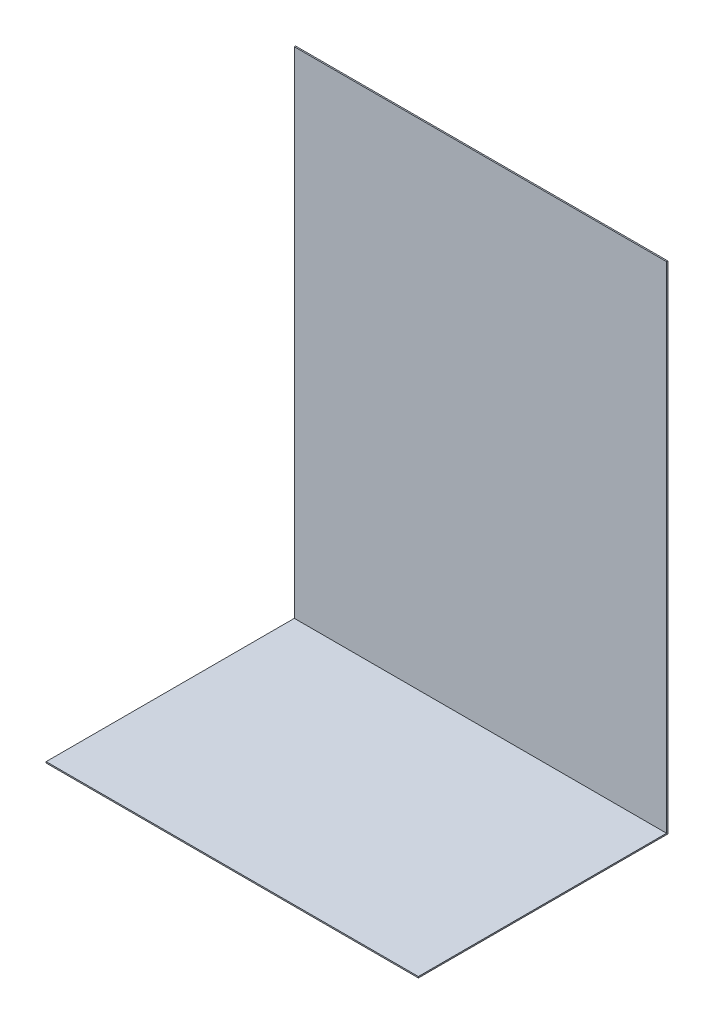
ISO-10303-21;
HEADER;
FILE_DESCRIPTION(('STEP AP214'),'2;1');
FILE_NAME('part.step','',(''),(''),'','','');
FILE_SCHEMA(('AUTOMOTIVE_DESIGN { 1 0 10303 214 1 1 1 1 }'));
ENDSEC;
DATA;
#1=APPLICATION_CONTEXT('core data for automotive mechanical design processes');
#2=APPLICATION_PROTOCOL_DEFINITION('international standard','automotive_design',2000,#1);
#3=PRODUCT_CONTEXT('',#1,'mechanical');
#4=PRODUCT('Part','Part','',(#3));
#5=PRODUCT_RELATED_PRODUCT_CATEGORY('part','',(#4));
#6=PRODUCT_DEFINITION_FORMATION('','',#4);
#7=PRODUCT_DEFINITION_CONTEXT('part definition',#1,'design');
#8=PRODUCT_DEFINITION('design','',#6,#7);
#9=PRODUCT_DEFINITION_SHAPE('','',#8);
#10=(LENGTH_UNIT() NAMED_UNIT(*) SI_UNIT(.MILLI.,.METRE.));
#11=(NAMED_UNIT(*) PLANE_ANGLE_UNIT() SI_UNIT($,.RADIAN.));
#12=(NAMED_UNIT(*) SI_UNIT($,.STERADIAN.) SOLID_ANGLE_UNIT());
#13=UNCERTAINTY_MEASURE_WITH_UNIT(LENGTH_MEASURE(1.E-05),#10,'distance_accuracy_value','');
#14=(GEOMETRIC_REPRESENTATION_CONTEXT(3) GLOBAL_UNCERTAINTY_ASSIGNED_CONTEXT((#13)) GLOBAL_UNIT_ASSIGNED_CONTEXT((#10,
#11,#12)) REPRESENTATION_CONTEXT('',''));
#15=CARTESIAN_POINT('',(0.,0.,0.));
#16=DIRECTION('',(0.,0.,1.));
#17=DIRECTION('',(1.,0.,0.));
#18=AXIS2_PLACEMENT_3D('',#15,#16,#17);
#19=CARTESIAN_POINT('',(914.4,1219.2,6.35));
#20=DIRECTION('',(-1.,0.,0.));
#21=DIRECTION('',(0.,-1.,0.));
#22=AXIS2_PLACEMENT_3D('',#19,#20,#21);
#23=PLANE('',#22);
#24=DIRECTION('',(0.,1.,0.));
#25=VECTOR('',#24,1.);
#26=CARTESIAN_POINT('',(914.4,1219.2,0.));
#27=LINE('',#26,#25);
#28=CARTESIAN_POINT('',(914.4,-1219.2,0.));
#29=VERTEX_POINT('',#28);
#30=CARTESIAN_POINT('',(914.4,1219.2,0.));
#31=VERTEX_POINT('',#30);
#32=EDGE_CURVE('E96',#29,#31,#27,.T.);
#33=ORIENTED_EDGE('',*,*,#32,.T.);
#34=DIRECTION('',(0.,0.,-1.));
#35=VECTOR('',#34,1.);
#36=CARTESIAN_POINT('',(914.4,1219.2,6.35));
#37=LINE('',#36,#35);
#38=CARTESIAN_POINT('',(914.4,1219.2,6.35));
#39=VERTEX_POINT('',#38);
#40=EDGE_CURVE('E11',#39,#31,#37,.T.);
#41=ORIENTED_EDGE('',*,*,#40,.F.);
#42=DIRECTION('',(0.,1.,0.));
#43=VECTOR('',#42,1.);
#44=CARTESIAN_POINT('',(914.4,1219.2,6.35));
#45=LINE('',#44,#43);
#46=CARTESIAN_POINT('',(914.4,-1212.85,6.35));
#47=VERTEX_POINT('',#46);
#48=EDGE_CURVE('E89',#47,#39,#45,.T.);
#49=ORIENTED_EDGE('',*,*,#48,.F.);
#50=DIRECTION('',(0.,0.,-1.));
#51=VECTOR('',#50,1.);
#52=CARTESIAN_POINT('',(914.4,-1212.85,1225.55));
#53=LINE('',#52,#51);
#54=CARTESIAN_POINT('',(914.4,-1212.85,1225.55));
#55=VERTEX_POINT('',#54);
#56=EDGE_CURVE('E104',#55,#47,#53,.T.);
#57=ORIENTED_EDGE('',*,*,#56,.F.);
#58=DIRECTION('',(0.,1.,0.));
#59=VECTOR('',#58,1.);
#60=CARTESIAN_POINT('',(914.4,-1219.2,1225.55));
#61=LINE('',#60,#59);
#62=CARTESIAN_POINT('',(914.4,-1219.2,1225.55));
#63=VERTEX_POINT('',#62);
#64=EDGE_CURVE('E99',#63,#55,#61,.T.);
#65=ORIENTED_EDGE('',*,*,#64,.F.);
#66=DIRECTION('',(0.,0.,-1.));
#67=VECTOR('',#66,1.);
#68=CARTESIAN_POINT('',(914.4,-1219.2,6.35));
#69=LINE('',#68,#67);
#70=EDGE_CURVE('E82',#63,#29,#69,.T.);
#71=ORIENTED_EDGE('',*,*,#70,.T.);
#72=EDGE_LOOP('',(#33,#41,#49,#57,#65,#71));
#73=FACE_BOUND('',#72,.T.);
#74=ADVANCED_FACE('F37',(#73),#23,.F.);
#75=CARTESIAN_POINT('',(-914.4,1219.2,6.35));
#76=DIRECTION('',(0.,-1.,0.));
#77=DIRECTION('',(0.,0.,-1.));
#78=AXIS2_PLACEMENT_3D('',#75,#76,#77);
#79=PLANE('',#78);
#80=DIRECTION('',(-1.,0.,0.));
#81=VECTOR('',#80,1.);
#82=CARTESIAN_POINT('',(-914.4,1219.2,0.));
#83=LINE('',#82,#81);
#84=CARTESIAN_POINT('',(-914.4,1219.2,0.));
#85=VERTEX_POINT('',#84);
#86=EDGE_CURVE('E103',#31,#85,#83,.T.);
#87=ORIENTED_EDGE('',*,*,#86,.T.);
#88=DIRECTION('',(0.,0.,-1.));
#89=VECTOR('',#88,1.);
#90=CARTESIAN_POINT('',(-914.4,1219.2,6.35));
#91=LINE('',#90,#89);
#92=CARTESIAN_POINT('',(-914.4,1219.2,6.35));
#93=VERTEX_POINT('',#92);
#94=EDGE_CURVE('E44',#93,#85,#91,.T.);
#95=ORIENTED_EDGE('',*,*,#94,.F.);
#96=DIRECTION('',(-1.,0.,0.));
#97=VECTOR('',#96,1.);
#98=CARTESIAN_POINT('',(-914.4,1219.2,6.35));
#99=LINE('',#98,#97);
#100=EDGE_CURVE('E57',#39,#93,#99,.T.);
#101=ORIENTED_EDGE('',*,*,#100,.F.);
#102=ORIENTED_EDGE('',*,*,#40,.T.);
#103=EDGE_LOOP('',(#87,#95,#101,#102));
#104=FACE_BOUND('',#103,.T.);
#105=ADVANCED_FACE('F120',(#104),#79,.F.);
#106=CARTESIAN_POINT('',(-914.4,1219.2,6.35));
#107=DIRECTION('',(1.,0.,0.));
#108=DIRECTION('',(0.,1.,0.));
#109=AXIS2_PLACEMENT_3D('',#106,#107,#108);
#110=PLANE('',#109);
#111=DIRECTION('',(0.,-1.,0.));
#112=VECTOR('',#111,1.);
#113=CARTESIAN_POINT('',(-914.4,1219.2,0.));
#114=LINE('',#113,#112);
#115=CARTESIAN_POINT('',(-914.4,-1219.2,0.));
#116=VERTEX_POINT('',#115);
#117=EDGE_CURVE('E90',#85,#116,#114,.T.);
#118=ORIENTED_EDGE('',*,*,#117,.T.);
#119=DIRECTION('',(0.,0.,-1.));
#120=VECTOR('',#119,1.);
#121=CARTESIAN_POINT('',(-914.4,-1219.2,6.35));
#122=LINE('',#121,#120);
#123=CARTESIAN_POINT('',(-914.4,-1219.2,1225.55));
#124=VERTEX_POINT('',#123);
#125=EDGE_CURVE('E85',#124,#116,#122,.T.);
#126=ORIENTED_EDGE('',*,*,#125,.F.);
#127=DIRECTION('',(0.,-1.,0.));
#128=VECTOR('',#127,1.);
#129=CARTESIAN_POINT('',(-914.4,-1219.2,1225.55));
#130=LINE('',#129,#128);
#131=CARTESIAN_POINT('',(-914.4,-1212.85,1225.55));
#132=VERTEX_POINT('',#131);
#133=EDGE_CURVE('E140',#132,#124,#130,.T.);
#134=ORIENTED_EDGE('',*,*,#133,.F.);
#135=DIRECTION('',(0.,0.,-1.));
#136=VECTOR('',#135,1.);
#137=CARTESIAN_POINT('',(-914.4,-1212.85,1225.55));
#138=LINE('',#137,#136);
#139=CARTESIAN_POINT('',(-914.4,-1212.85,6.35));
#140=VERTEX_POINT('',#139);
#141=EDGE_CURVE('E108',#132,#140,#138,.T.);
#142=ORIENTED_EDGE('',*,*,#141,.T.);
#143=DIRECTION('',(0.,-1.,0.));
#144=VECTOR('',#143,1.);
#145=CARTESIAN_POINT('',(-914.4,1219.2,6.35));
#146=LINE('',#145,#144);
#147=EDGE_CURVE('E100',#93,#140,#146,.T.);
#148=ORIENTED_EDGE('',*,*,#147,.F.);
#149=ORIENTED_EDGE('',*,*,#94,.T.);
#150=EDGE_LOOP('',(#118,#126,#134,#142,#148,#149));
#151=FACE_BOUND('',#150,.T.);
#152=ADVANCED_FACE('F117',(#151),#110,.F.);
#153=CARTESIAN_POINT('',(-914.4,-1219.2,6.35));
#154=DIRECTION('',(0.,1.,0.));
#155=DIRECTION('',(0.,0.,1.));
#156=AXIS2_PLACEMENT_3D('',#153,#154,#155);
#157=PLANE('',#156);
#158=DIRECTION('',(1.,0.,0.));
#159=VECTOR('',#158,1.);
#160=CARTESIAN_POINT('',(-914.4,-1219.2,0.));
#161=LINE('',#160,#159);
#162=EDGE_CURVE('E77',#116,#29,#161,.T.);
#163=ORIENTED_EDGE('',*,*,#162,.T.);
#164=ORIENTED_EDGE('',*,*,#70,.F.);
#165=DIRECTION('',(1.,0.,0.));
#166=VECTOR('',#165,1.);
#167=CARTESIAN_POINT('',(-914.4,-1219.2,1225.55));
#168=LINE('',#167,#166);
#169=EDGE_CURVE('E136',#124,#63,#168,.T.);
#170=ORIENTED_EDGE('',*,*,#169,.F.);
#171=ORIENTED_EDGE('',*,*,#125,.T.);
#172=EDGE_LOOP('',(#163,#164,#170,#171));
#173=FACE_BOUND('',#172,.T.);
#174=ADVANCED_FACE('F79',(#173),#157,.F.);
#175=CARTESIAN_POINT('',(0.,0.,6.35));
#176=DIRECTION('',(0.,0.,1.));
#177=DIRECTION('',(1.,0.,0.));
#178=AXIS2_PLACEMENT_3D('',#175,#176,#177);
#179=PLANE('',#178);
#180=DIRECTION('',(-1.,0.,0.));
#181=VECTOR('',#180,1.);
#182=CARTESIAN_POINT('',(-914.4,-1212.85,6.35));
#183=LINE('',#182,#181);
#184=EDGE_CURVE('E51',#47,#140,#183,.T.);
#185=ORIENTED_EDGE('',*,*,#184,.F.);
#186=ORIENTED_EDGE('',*,*,#48,.T.);
#187=ORIENTED_EDGE('',*,*,#100,.T.);
#188=ORIENTED_EDGE('',*,*,#147,.T.);
#189=EDGE_LOOP('',(#185,#186,#187,#188));
#190=FACE_BOUND('',#189,.T.);
#191=ADVANCED_FACE('F141',(#190),#179,.T.);
#192=CARTESIAN_POINT('',(0.,0.,0.));
#193=DIRECTION('',(0.,0.,1.));
#194=DIRECTION('',(1.,0.,0.));
#195=AXIS2_PLACEMENT_3D('',#192,#193,#194);
#196=PLANE('',#195);
#197=ORIENTED_EDGE('',*,*,#32,.F.);
#198=ORIENTED_EDGE('',*,*,#162,.F.);
#199=ORIENTED_EDGE('',*,*,#117,.F.);
#200=ORIENTED_EDGE('',*,*,#86,.F.);
#201=EDGE_LOOP('',(#197,#198,#199,#200));
#202=FACE_BOUND('',#201,.T.);
#203=ADVANCED_FACE('F102',(#202),#196,.F.);
#204=CARTESIAN_POINT('',(-914.4,-1212.85,1225.55));
#205=DIRECTION('',(0.,-1.,0.));
#206=DIRECTION('',(0.,0.,-1.));
#207=AXIS2_PLACEMENT_3D('',#204,#205,#206);
#208=PLANE('',#207);
#209=ORIENTED_EDGE('',*,*,#184,.T.);
#210=ORIENTED_EDGE('',*,*,#141,.F.);
#211=DIRECTION('',(-1.,0.,0.));
#212=VECTOR('',#211,1.);
#213=CARTESIAN_POINT('',(-914.4,-1212.85,1225.55));
#214=LINE('',#213,#212);
#215=EDGE_CURVE('E129',#55,#132,#214,.T.);
#216=ORIENTED_EDGE('',*,*,#215,.F.);
#217=ORIENTED_EDGE('',*,*,#56,.T.);
#218=EDGE_LOOP('',(#209,#210,#216,#217));
#219=FACE_BOUND('',#218,.T.);
#220=ADVANCED_FACE('F125',(#219),#208,.F.);
#221=CARTESIAN_POINT('',(0.,0.,1225.55));
#222=DIRECTION('',(0.,0.,-1.));
#223=DIRECTION('',(-1.,0.,0.));
#224=AXIS2_PLACEMENT_3D('',#221,#222,#223);
#225=PLANE('',#224);
#226=ORIENTED_EDGE('',*,*,#133,.T.);
#227=ORIENTED_EDGE('',*,*,#169,.T.);
#228=ORIENTED_EDGE('',*,*,#64,.T.);
#229=ORIENTED_EDGE('',*,*,#215,.T.);
#230=EDGE_LOOP('',(#226,#227,#228,#229));
#231=FACE_BOUND('',#230,.T.);
#232=ADVANCED_FACE('F146',(#231),#225,.F.);
#233=CLOSED_SHELL('',(#74,#105,#152,#174,#191,#203,#220,#232));
#234=MANIFOLD_SOLID_BREP('B2',#233);
#235=ADVANCED_BREP_SHAPE_REPRESENTATION('',(#18,#234),#14);
#236=SHAPE_DEFINITION_REPRESENTATION(#9,#235);
ENDSEC;
END-ISO-10303-21;
